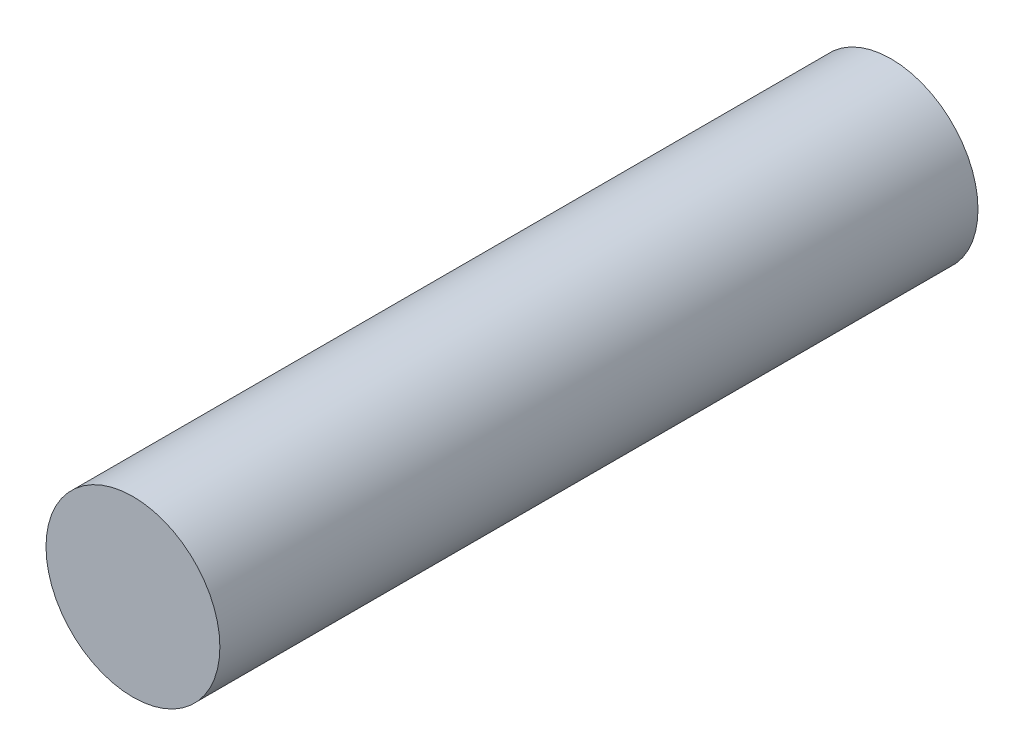
ISO-10303-21;
HEADER;
FILE_DESCRIPTION(('STEP AP214'),'2;1');
FILE_NAME('part.step','',(''),(''),'','','');
FILE_SCHEMA(('AUTOMOTIVE_DESIGN { 1 0 10303 214 1 1 1 1 }'));
ENDSEC;
DATA;
#1=APPLICATION_CONTEXT('core data for automotive mechanical design processes');
#2=APPLICATION_PROTOCOL_DEFINITION('international standard','automotive_design',2000,#1);
#3=PRODUCT_CONTEXT('',#1,'mechanical');
#4=PRODUCT('Part','Part','',(#3));
#5=PRODUCT_RELATED_PRODUCT_CATEGORY('part','',(#4));
#6=PRODUCT_DEFINITION_FORMATION('','',#4);
#7=PRODUCT_DEFINITION_CONTEXT('part definition',#1,'design');
#8=PRODUCT_DEFINITION('design','',#6,#7);
#9=PRODUCT_DEFINITION_SHAPE('','',#8);
#10=(LENGTH_UNIT() NAMED_UNIT(*) SI_UNIT(.MILLI.,.METRE.));
#11=(NAMED_UNIT(*) PLANE_ANGLE_UNIT() SI_UNIT($,.RADIAN.));
#12=(NAMED_UNIT(*) SI_UNIT($,.STERADIAN.) SOLID_ANGLE_UNIT());
#13=UNCERTAINTY_MEASURE_WITH_UNIT(LENGTH_MEASURE(1.E-05),#10,'distance_accuracy_value','');
#14=(GEOMETRIC_REPRESENTATION_CONTEXT(3) GLOBAL_UNCERTAINTY_ASSIGNED_CONTEXT((#13)) GLOBAL_UNIT_ASSIGNED_CONTEXT((#10,
#11,#12)) REPRESENTATION_CONTEXT('',''));
#15=CARTESIAN_POINT('',(0.,0.,0.));
#16=DIRECTION('',(0.,0.,1.));
#17=DIRECTION('',(1.,0.,0.));
#18=AXIS2_PLACEMENT_3D('',#15,#16,#17);
#19=CARTESIAN_POINT('',(0.,0.,54.5));
#20=DIRECTION('',(0.,0.,-1.));
#21=DIRECTION('',(-1.,0.,0.));
#22=AXIS2_PLACEMENT_3D('',#19,#20,#21);
#23=CYLINDRICAL_SURFACE('',#22,12.5);
#24=CARTESIAN_POINT('',(0.,0.,54.5));
#25=DIRECTION('',(0.,0.,1.));
#26=DIRECTION('',(1.,0.,0.));
#27=AXIS2_PLACEMENT_3D('',#24,#25,#26);
#28=CIRCLE('',#27,12.5);
#29=CARTESIAN_POINT('',(12.5,0.,54.5));
#30=VERTEX_POINT('',#29);
#31=EDGE_CURVE('E10',#30,#30,#28,.T.);
#32=ORIENTED_EDGE('',*,*,#31,.F.);
#33=EDGE_LOOP('',(#32));
#34=FACE_BOUND('',#33,.T.);
#35=CARTESIAN_POINT('',(0.,0.,-54.5));
#36=DIRECTION('',(0.,0.,1.));
#37=DIRECTION('',(1.,0.,0.));
#38=AXIS2_PLACEMENT_3D('',#35,#36,#37);
#39=CIRCLE('',#38,12.5);
#40=CARTESIAN_POINT('',(12.5,0.,-54.5));
#41=VERTEX_POINT('',#40);
#42=EDGE_CURVE('E42',#41,#41,#39,.T.);
#43=ORIENTED_EDGE('',*,*,#42,.T.);
#44=EDGE_LOOP('',(#43));
#45=FACE_BOUND('',#44,.T.);
#46=ADVANCED_FACE('F39',(#34,#45),#23,.T.);
#47=CARTESIAN_POINT('',(0.,0.,54.5));
#48=DIRECTION('',(0.,0.,1.));
#49=DIRECTION('',(1.,0.,0.));
#50=AXIS2_PLACEMENT_3D('',#47,#48,#49);
#51=PLANE('',#50);
#52=ORIENTED_EDGE('',*,*,#31,.T.);
#53=EDGE_LOOP('',(#52));
#54=FACE_BOUND('',#53,.T.);
#55=ADVANCED_FACE('F54',(#54),#51,.T.);
#56=CARTESIAN_POINT('',(0.,0.,-54.5));
#57=DIRECTION('',(0.,0.,1.));
#58=DIRECTION('',(1.,0.,0.));
#59=AXIS2_PLACEMENT_3D('',#56,#57,#58);
#60=PLANE('',#59);
#61=ORIENTED_EDGE('',*,*,#42,.F.);
#62=EDGE_LOOP('',(#61));
#63=FACE_BOUND('',#62,.T.);
#64=ADVANCED_FACE('F52',(#63),#60,.F.);
#65=CLOSED_SHELL('',(#46,#55,#64));
#66=MANIFOLD_SOLID_BREP('B2',#65);
#67=ADVANCED_BREP_SHAPE_REPRESENTATION('',(#18,#66),#14);
#68=SHAPE_DEFINITION_REPRESENTATION(#9,#67);
ENDSEC;
END-ISO-10303-21;
